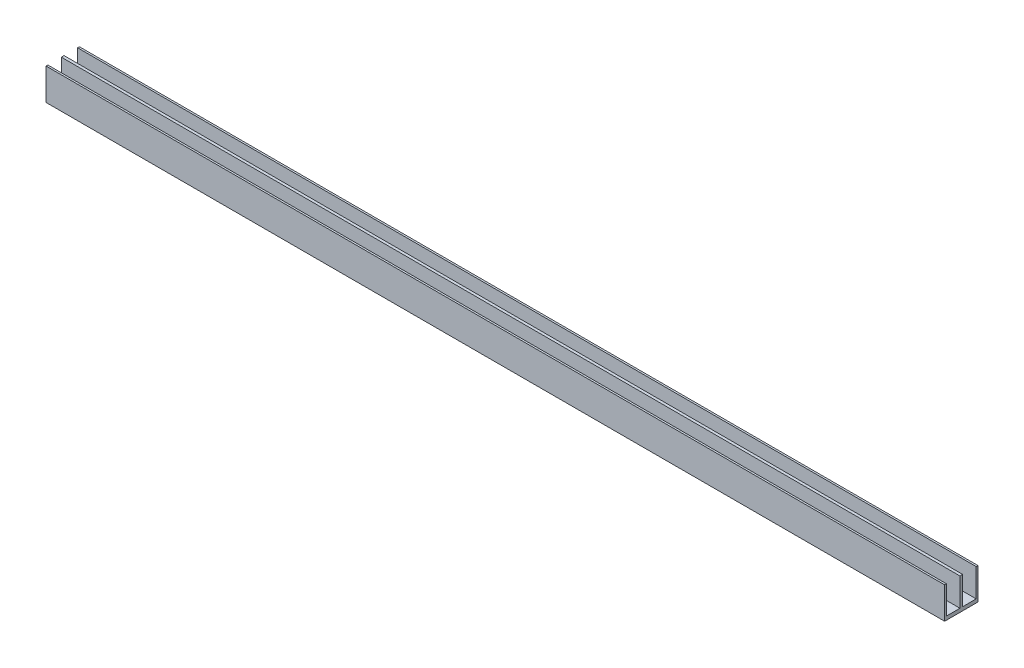
ISO-10303-21;
HEADER;
FILE_DESCRIPTION(('STEP AP214'),'2;1');
FILE_NAME('part.step','',(''),(''),'','','');
FILE_SCHEMA(('AUTOMOTIVE_DESIGN { 1 0 10303 214 1 1 1 1 }'));
ENDSEC;
DATA;
#1=APPLICATION_CONTEXT('core data for automotive mechanical design processes');
#2=APPLICATION_PROTOCOL_DEFINITION('international standard','automotive_design',2000,#1);
#3=PRODUCT_CONTEXT('',#1,'mechanical');
#4=PRODUCT('Part','Part','',(#3));
#5=PRODUCT_RELATED_PRODUCT_CATEGORY('part','',(#4));
#6=PRODUCT_DEFINITION_FORMATION('','',#4);
#7=PRODUCT_DEFINITION_CONTEXT('part definition',#1,'design');
#8=PRODUCT_DEFINITION('design','',#6,#7);
#9=PRODUCT_DEFINITION_SHAPE('','',#8);
#10=(LENGTH_UNIT() NAMED_UNIT(*) SI_UNIT(.MILLI.,.METRE.));
#11=(NAMED_UNIT(*) PLANE_ANGLE_UNIT() SI_UNIT($,.RADIAN.));
#12=(NAMED_UNIT(*) SI_UNIT($,.STERADIAN.) SOLID_ANGLE_UNIT());
#13=UNCERTAINTY_MEASURE_WITH_UNIT(LENGTH_MEASURE(1.E-05),#10,'distance_accuracy_value','');
#14=(GEOMETRIC_REPRESENTATION_CONTEXT(3) GLOBAL_UNCERTAINTY_ASSIGNED_CONTEXT((#13)) GLOBAL_UNIT_ASSIGNED_CONTEXT((#10,
#11,#12)) REPRESENTATION_CONTEXT('',''));
#15=CARTESIAN_POINT('',(0.,0.,0.));
#16=DIRECTION('',(0.,0.,1.));
#17=DIRECTION('',(1.,0.,0.));
#18=AXIS2_PLACEMENT_3D('',#15,#16,#17);
#19=CARTESIAN_POINT('',(0.,35.,0.));
#20=DIRECTION('',(0.,1.,0.));
#21=DIRECTION('',(0.,0.,1.));
#22=AXIS2_PLACEMENT_3D('',#19,#20,#21);
#23=PLANE('',#22);
#24=DIRECTION('',(0.,0.,-1.));
#25=VECTOR('',#24,1.);
#26=CARTESIAN_POINT('',(-531.123966942149,35.,-17.6446280991736));
#27=LINE('',#26,#25);
#28=CARTESIAN_POINT('',(-531.123966942149,35.,-187.644628099174));
#29=VERTEX_POINT('',#28);
#30=CARTESIAN_POINT('',(-531.123966942149,35.,-190.644628099174));
#31=VERTEX_POINT('',#30);
#32=EDGE_CURVE('E218',#29,#31,#27,.T.);
#33=ORIENTED_EDGE('',*,*,#32,.F.);
#34=DIRECTION('',(-1.,0.,0.));
#35=VECTOR('',#34,1.);
#36=CARTESIAN_POINT('',(464.876033057851,35.,-187.644628099174));
#37=LINE('',#36,#35);
#38=CARTESIAN_POINT('',(464.876033057851,35.,-187.644628099174));
#39=VERTEX_POINT('',#38);
#40=EDGE_CURVE('E182',#39,#29,#37,.T.);
#41=ORIENTED_EDGE('',*,*,#40,.F.);
#42=DIRECTION('',(0.,0.,-1.));
#43=VECTOR('',#42,1.);
#44=CARTESIAN_POINT('',(464.876033057851,35.,-207.644628099174));
#45=LINE('',#44,#43);
#46=CARTESIAN_POINT('',(464.876033057851,35.,-190.644628099174));
#47=VERTEX_POINT('',#46);
#48=EDGE_CURVE('E171',#39,#47,#45,.T.);
#49=ORIENTED_EDGE('',*,*,#48,.T.);
#50=DIRECTION('',(1.,0.,0.));
#51=VECTOR('',#50,1.);
#52=CARTESIAN_POINT('',(464.876033057851,35.,-190.644628099174));
#53=LINE('',#52,#51);
#54=EDGE_CURVE('E193',#31,#47,#53,.T.);
#55=ORIENTED_EDGE('',*,*,#54,.F.);
#56=EDGE_LOOP('',(#33,#41,#49,#55));
#57=FACE_BOUND('',#56,.T.);
#58=ADVANCED_FACE('F34',(#57),#23,.T.);
#59=CARTESIAN_POINT('',(-531.123966942149,35.,-170.644628099174));
#60=VERTEX_POINT('',#59);
#61=CARTESIAN_POINT('',(-531.123966942149,35.,-172.644628099174));
#62=VERTEX_POINT('',#61);
#63=EDGE_CURVE('E216',#60,#62,#27,.T.);
#64=ORIENTED_EDGE('',*,*,#63,.F.);
#65=DIRECTION('',(1.,0.,0.));
#66=VECTOR('',#65,1.);
#67=CARTESIAN_POINT('',(-535.123966942149,35.,-170.644628099174));
#68=LINE('',#67,#66);
#69=CARTESIAN_POINT('',(464.876033057851,35.,-170.644628099174));
#70=VERTEX_POINT('',#69);
#71=EDGE_CURVE('E145',#60,#70,#68,.T.);
#72=ORIENTED_EDGE('',*,*,#71,.T.);
#73=CARTESIAN_POINT('',(464.876033057851,35.,-172.644628099174));
#74=VERTEX_POINT('',#73);
#75=EDGE_CURVE('E162',#70,#74,#45,.T.);
#76=ORIENTED_EDGE('',*,*,#75,.T.);
#77=DIRECTION('',(1.,0.,0.));
#78=VECTOR('',#77,1.);
#79=CARTESIAN_POINT('',(464.876033057851,35.,-172.644628099174));
#80=LINE('',#79,#78);
#81=EDGE_CURVE('E179',#62,#74,#80,.T.);
#82=ORIENTED_EDGE('',*,*,#81,.F.);
#83=EDGE_LOOP('',(#64,#72,#76,#82));
#84=FACE_BOUND('',#83,.T.);
#85=ADVANCED_FACE('F226',(#84),#23,.T.);
#86=CARTESIAN_POINT('',(-535.123966942149,35.,-170.644628099174));
#87=DIRECTION('',(0.,0.,-1.));
#88=DIRECTION('',(-1.,0.,0.));
#89=AXIS2_PLACEMENT_3D('',#86,#87,#88);
#90=PLANE('',#89);
#91=ORIENTED_EDGE('',*,*,#71,.F.);
#92=DIRECTION('',(0.,-1.,0.));
#93=VECTOR('',#92,1.);
#94=CARTESIAN_POINT('',(-531.123966942149,35.,-170.644628099174));
#95=LINE('',#94,#93);
#96=CARTESIAN_POINT('',(-531.123966942149,0.,-170.644628099174));
#97=VERTEX_POINT('',#96);
#98=EDGE_CURVE('E165',#60,#97,#95,.T.);
#99=ORIENTED_EDGE('',*,*,#98,.T.);
#100=DIRECTION('',(1.,0.,0.));
#101=VECTOR('',#100,1.);
#102=CARTESIAN_POINT('',(-535.123966942149,0.,-170.644628099174));
#103=LINE('',#102,#101);
#104=CARTESIAN_POINT('',(464.876033057851,0.,-170.644628099174));
#105=VERTEX_POINT('',#104);
#106=EDGE_CURVE('E139',#97,#105,#103,.T.);
#107=ORIENTED_EDGE('',*,*,#106,.T.);
#108=DIRECTION('',(0.,-1.,0.));
#109=VECTOR('',#108,1.);
#110=CARTESIAN_POINT('',(464.876033057851,35.,-170.644628099174));
#111=LINE('',#110,#109);
#112=EDGE_CURVE('E42',#70,#105,#111,.T.);
#113=ORIENTED_EDGE('',*,*,#112,.F.);
#114=EDGE_LOOP('',(#91,#99,#107,#113));
#115=FACE_BOUND('',#114,.T.);
#116=ADVANCED_FACE('F36',(#115),#90,.F.);
#117=CARTESIAN_POINT('',(464.876033057851,35.,-207.644628099174));
#118=DIRECTION('',(-1.,0.,0.));
#119=DIRECTION('',(0.,0.,1.));
#120=AXIS2_PLACEMENT_3D('',#117,#118,#119);
#121=PLANE('',#120);
#122=DIRECTION('',(0.,0.,-1.));
#123=VECTOR('',#122,1.);
#124=CARTESIAN_POINT('',(464.876033057851,4.,-205.644628099174));
#125=LINE('',#124,#123);
#126=CARTESIAN_POINT('',(464.876033057851,4.,-190.644628099174));
#127=VERTEX_POINT('',#126);
#128=CARTESIAN_POINT('',(464.876033057851,4.,-205.644628099174));
#129=VERTEX_POINT('',#128);
#130=EDGE_CURVE('E195',#127,#129,#125,.T.);
#131=ORIENTED_EDGE('',*,*,#130,.F.);
#132=DIRECTION('',(0.,1.,0.));
#133=VECTOR('',#132,1.);
#134=CARTESIAN_POINT('',(464.876033057851,4.,-190.644628099174));
#135=LINE('',#134,#133);
#136=EDGE_CURVE('E166',#127,#47,#135,.T.);
#137=ORIENTED_EDGE('',*,*,#136,.T.);
#138=ORIENTED_EDGE('',*,*,#48,.F.);
#139=DIRECTION('',(0.,1.,0.));
#140=VECTOR('',#139,1.);
#141=CARTESIAN_POINT('',(464.876033057851,4.,-187.644628099174));
#142=LINE('',#141,#140);
#143=CARTESIAN_POINT('',(464.876033057851,4.,-187.644628099174));
#144=VERTEX_POINT('',#143);
#145=EDGE_CURVE('E173',#144,#39,#142,.T.);
#146=ORIENTED_EDGE('',*,*,#145,.F.);
#147=DIRECTION('',(0.,0.,-1.));
#148=VECTOR('',#147,1.);
#149=CARTESIAN_POINT('',(464.876033057851,4.,-187.644628099174));
#150=LINE('',#149,#148);
#151=CARTESIAN_POINT('',(464.876033057851,4.,-172.644628099174));
#152=VERTEX_POINT('',#151);
#153=EDGE_CURVE('E181',#152,#144,#150,.T.);
#154=ORIENTED_EDGE('',*,*,#153,.F.);
#155=DIRECTION('',(0.,1.,0.));
#156=VECTOR('',#155,1.);
#157=CARTESIAN_POINT('',(464.876033057851,4.,-172.644628099174));
#158=LINE('',#157,#156);
#159=EDGE_CURVE('E175',#152,#74,#158,.T.);
#160=ORIENTED_EDGE('',*,*,#159,.T.);
#161=ORIENTED_EDGE('',*,*,#75,.F.);
#162=ORIENTED_EDGE('',*,*,#112,.T.);
#163=DIRECTION('',(0.,0.,-1.));
#164=VECTOR('',#163,1.);
#165=CARTESIAN_POINT('',(464.876033057851,0.,-207.644628099174));
#166=LINE('',#165,#164);
#167=CARTESIAN_POINT('',(464.876033057851,0.,-207.644628099174));
#168=VERTEX_POINT('',#167);
#169=EDGE_CURVE('E146',#105,#168,#166,.T.);
#170=ORIENTED_EDGE('',*,*,#169,.T.);
#171=DIRECTION('',(0.,-1.,0.));
#172=VECTOR('',#171,1.);
#173=CARTESIAN_POINT('',(464.876033057851,35.,-207.644628099174));
#174=LINE('',#173,#172);
#175=CARTESIAN_POINT('',(464.876033057851,35.,-207.644628099174));
#176=VERTEX_POINT('',#175);
#177=EDGE_CURVE('E144',#176,#168,#174,.T.);
#178=ORIENTED_EDGE('',*,*,#177,.F.);
#179=CARTESIAN_POINT('',(464.876033057851,35.,-205.644628099174));
#180=VERTEX_POINT('',#179);
#181=EDGE_CURVE('E148',#180,#176,#45,.T.);
#182=ORIENTED_EDGE('',*,*,#181,.F.);
#183=DIRECTION('',(0.,1.,0.));
#184=VECTOR('',#183,1.);
#185=CARTESIAN_POINT('',(464.876033057851,4.,-205.644628099174));
#186=LINE('',#185,#184);
#187=EDGE_CURVE('E56',#129,#180,#186,.T.);
#188=ORIENTED_EDGE('',*,*,#187,.F.);
#189=EDGE_LOOP('',(#131,#137,#138,#146,#154,#160,#161,#162,#170,#178,#182,#188));
#190=FACE_BOUND('',#189,.T.);
#191=ADVANCED_FACE('F159',(#190),#121,.F.);
#192=CARTESIAN_POINT('',(-535.123966942149,35.,-207.644628099174));
#193=DIRECTION('',(0.,0.,1.));
#194=DIRECTION('',(1.,0.,0.));
#195=AXIS2_PLACEMENT_3D('',#192,#193,#194);
#196=PLANE('',#195);
#197=DIRECTION('',(-1.,0.,0.));
#198=VECTOR('',#197,1.);
#199=CARTESIAN_POINT('',(-535.123966942149,0.,-207.644628099174));
#200=LINE('',#199,#198);
#201=CARTESIAN_POINT('',(-531.123966942149,0.,-207.644628099174));
#202=VERTEX_POINT('',#201);
#203=EDGE_CURVE('E138',#168,#202,#200,.T.);
#204=ORIENTED_EDGE('',*,*,#203,.T.);
#205=DIRECTION('',(0.,-1.,0.));
#206=VECTOR('',#205,1.);
#207=CARTESIAN_POINT('',(-531.123966942149,0.,-207.644628099174));
#208=LINE('',#207,#206);
#209=CARTESIAN_POINT('',(-531.123966942149,35.,-207.644628099174));
#210=VERTEX_POINT('',#209);
#211=EDGE_CURVE('E121',#210,#202,#208,.T.);
#212=ORIENTED_EDGE('',*,*,#211,.F.);
#213=DIRECTION('',(-1.,0.,0.));
#214=VECTOR('',#213,1.);
#215=CARTESIAN_POINT('',(-535.123966942149,35.,-207.644628099174));
#216=LINE('',#215,#214);
#217=EDGE_CURVE('E153',#176,#210,#216,.T.);
#218=ORIENTED_EDGE('',*,*,#217,.F.);
#219=ORIENTED_EDGE('',*,*,#177,.T.);
#220=EDGE_LOOP('',(#204,#212,#218,#219));
#221=FACE_BOUND('',#220,.T.);
#222=ADVANCED_FACE('F142',(#221),#196,.F.);
#223=CARTESIAN_POINT('',(-531.123966942149,35.,-205.644628099174));
#224=VERTEX_POINT('',#223);
#225=EDGE_CURVE('E127',#224,#210,#27,.T.);
#226=ORIENTED_EDGE('',*,*,#225,.F.);
#227=DIRECTION('',(-1.,0.,0.));
#228=VECTOR('',#227,1.);
#229=CARTESIAN_POINT('',(464.876033057851,35.,-205.644628099174));
#230=LINE('',#229,#228);
#231=EDGE_CURVE('E178',#180,#224,#230,.T.);
#232=ORIENTED_EDGE('',*,*,#231,.F.);
#233=ORIENTED_EDGE('',*,*,#181,.T.);
#234=ORIENTED_EDGE('',*,*,#217,.T.);
#235=EDGE_LOOP('',(#226,#232,#233,#234));
#236=FACE_BOUND('',#235,.T.);
#237=ADVANCED_FACE('F229',(#236),#23,.T.);
#238=CARTESIAN_POINT('',(0.,0.,0.));
#239=DIRECTION('',(0.,1.,0.));
#240=DIRECTION('',(0.,0.,1.));
#241=AXIS2_PLACEMENT_3D('',#238,#239,#240);
#242=PLANE('',#241);
#243=ORIENTED_EDGE('',*,*,#106,.F.);
#244=DIRECTION('',(0.,0.,-1.));
#245=VECTOR('',#244,1.);
#246=CARTESIAN_POINT('',(-531.123966942149,0.,-17.6446280991736));
#247=LINE('',#246,#245);
#248=EDGE_CURVE('E124',#97,#202,#247,.T.);
#249=ORIENTED_EDGE('',*,*,#248,.T.);
#250=ORIENTED_EDGE('',*,*,#203,.F.);
#251=ORIENTED_EDGE('',*,*,#169,.F.);
#252=EDGE_LOOP('',(#243,#249,#250,#251));
#253=FACE_BOUND('',#252,.T.);
#254=ADVANCED_FACE('F136',(#253),#242,.F.);
#255=CARTESIAN_POINT('',(464.876033057851,4.,-172.644628099174));
#256=DIRECTION('',(0.,0.,1.));
#257=DIRECTION('',(1.,0.,0.));
#258=AXIS2_PLACEMENT_3D('',#255,#256,#257);
#259=PLANE('',#258);
#260=DIRECTION('',(1.,0.,0.));
#261=VECTOR('',#260,1.);
#262=CARTESIAN_POINT('',(464.876033057851,4.,-172.644628099174));
#263=LINE('',#262,#261);
#264=CARTESIAN_POINT('',(-531.123966942149,4.,-172.644628099174));
#265=VERTEX_POINT('',#264);
#266=EDGE_CURVE('E176',#265,#152,#263,.T.);
#267=ORIENTED_EDGE('',*,*,#266,.F.);
#268=DIRECTION('',(0.,1.,0.));
#269=VECTOR('',#268,1.);
#270=CARTESIAN_POINT('',(-531.123966942149,4.,-172.644628099174));
#271=LINE('',#270,#269);
#272=EDGE_CURVE('E204',#265,#62,#271,.T.);
#273=ORIENTED_EDGE('',*,*,#272,.T.);
#274=ORIENTED_EDGE('',*,*,#81,.T.);
#275=ORIENTED_EDGE('',*,*,#159,.F.);
#276=EDGE_LOOP('',(#267,#273,#274,#275));
#277=FACE_BOUND('',#276,.T.);
#278=ADVANCED_FACE('F224',(#277),#259,.F.);
#279=CARTESIAN_POINT('',(464.876033057851,4.,-187.644628099174));
#280=DIRECTION('',(0.,0.,-1.));
#281=DIRECTION('',(-1.,0.,0.));
#282=AXIS2_PLACEMENT_3D('',#279,#280,#281);
#283=PLANE('',#282);
#284=ORIENTED_EDGE('',*,*,#40,.T.);
#285=DIRECTION('',(0.,-1.,0.));
#286=VECTOR('',#285,1.);
#287=CARTESIAN_POINT('',(-531.123966942149,4.,-187.644628099174));
#288=LINE('',#287,#286);
#289=CARTESIAN_POINT('',(-531.123966942149,4.,-187.644628099174));
#290=VERTEX_POINT('',#289);
#291=EDGE_CURVE('E207',#29,#290,#288,.T.);
#292=ORIENTED_EDGE('',*,*,#291,.T.);
#293=DIRECTION('',(-1.,0.,0.));
#294=VECTOR('',#293,1.);
#295=CARTESIAN_POINT('',(464.876033057851,4.,-187.644628099174));
#296=LINE('',#295,#294);
#297=EDGE_CURVE('E186',#144,#290,#296,.T.);
#298=ORIENTED_EDGE('',*,*,#297,.F.);
#299=ORIENTED_EDGE('',*,*,#145,.T.);
#300=EDGE_LOOP('',(#284,#292,#298,#299));
#301=FACE_BOUND('',#300,.T.);
#302=ADVANCED_FACE('F267',(#301),#283,.F.);
#303=CARTESIAN_POINT('',(0.,4.,0.));
#304=DIRECTION('',(0.,-1.,0.));
#305=DIRECTION('',(0.,0.,-1.));
#306=AXIS2_PLACEMENT_3D('',#303,#304,#305);
#307=PLANE('',#306);
#308=ORIENTED_EDGE('',*,*,#297,.T.);
#309=DIRECTION('',(0.,0.,1.));
#310=VECTOR('',#309,1.);
#311=CARTESIAN_POINT('',(-531.123966942149,4.,0.));
#312=LINE('',#311,#310);
#313=EDGE_CURVE('E210',#290,#265,#312,.T.);
#314=ORIENTED_EDGE('',*,*,#313,.T.);
#315=ORIENTED_EDGE('',*,*,#266,.T.);
#316=ORIENTED_EDGE('',*,*,#153,.T.);
#317=EDGE_LOOP('',(#308,#314,#315,#316));
#318=FACE_BOUND('',#317,.T.);
#319=ADVANCED_FACE('F260',(#318),#307,.F.);
#320=CARTESIAN_POINT('',(464.876033057851,4.,-190.644628099174));
#321=DIRECTION('',(0.,0.,1.));
#322=DIRECTION('',(1.,0.,0.));
#323=AXIS2_PLACEMENT_3D('',#320,#321,#322);
#324=PLANE('',#323);
#325=DIRECTION('',(1.,0.,0.));
#326=VECTOR('',#325,1.);
#327=CARTESIAN_POINT('',(464.876033057851,4.,-190.644628099174));
#328=LINE('',#327,#326);
#329=CARTESIAN_POINT('',(-531.123966942149,4.,-190.644628099174));
#330=VERTEX_POINT('',#329);
#331=EDGE_CURVE('E191',#330,#127,#328,.T.);
#332=ORIENTED_EDGE('',*,*,#331,.F.);
#333=DIRECTION('',(0.,1.,0.));
#334=VECTOR('',#333,1.);
#335=CARTESIAN_POINT('',(-531.123966942149,4.,-190.644628099174));
#336=LINE('',#335,#334);
#337=EDGE_CURVE('E49',#330,#31,#336,.T.);
#338=ORIENTED_EDGE('',*,*,#337,.T.);
#339=ORIENTED_EDGE('',*,*,#54,.T.);
#340=ORIENTED_EDGE('',*,*,#136,.F.);
#341=EDGE_LOOP('',(#332,#338,#339,#340));
#342=FACE_BOUND('',#341,.T.);
#343=ADVANCED_FACE('F258',(#342),#324,.F.);
#344=CARTESIAN_POINT('',(464.876033057851,4.,-205.644628099174));
#345=DIRECTION('',(0.,0.,-1.));
#346=DIRECTION('',(-1.,0.,0.));
#347=AXIS2_PLACEMENT_3D('',#344,#345,#346);
#348=PLANE('',#347);
#349=ORIENTED_EDGE('',*,*,#231,.T.);
#350=DIRECTION('',(0.,-1.,0.));
#351=VECTOR('',#350,1.);
#352=CARTESIAN_POINT('',(-531.123966942149,4.,-205.644628099174));
#353=LINE('',#352,#351);
#354=CARTESIAN_POINT('',(-531.123966942149,4.,-205.644628099174));
#355=VERTEX_POINT('',#354);
#356=EDGE_CURVE('E214',#224,#355,#353,.T.);
#357=ORIENTED_EDGE('',*,*,#356,.T.);
#358=DIRECTION('',(-1.,0.,0.));
#359=VECTOR('',#358,1.);
#360=CARTESIAN_POINT('',(464.876033057851,4.,-205.644628099174));
#361=LINE('',#360,#359);
#362=EDGE_CURVE('E198',#129,#355,#361,.T.);
#363=ORIENTED_EDGE('',*,*,#362,.F.);
#364=ORIENTED_EDGE('',*,*,#187,.T.);
#365=EDGE_LOOP('',(#349,#357,#363,#364));
#366=FACE_BOUND('',#365,.T.);
#367=ADVANCED_FACE('F245',(#366),#348,.F.);
#368=CARTESIAN_POINT('',(0.,4.,0.));
#369=DIRECTION('',(0.,-1.,0.));
#370=DIRECTION('',(0.,0.,-1.));
#371=AXIS2_PLACEMENT_3D('',#368,#369,#370);
#372=PLANE('',#371);
#373=ORIENTED_EDGE('',*,*,#362,.T.);
#374=DIRECTION('',(0.,0.,1.));
#375=VECTOR('',#374,1.);
#376=CARTESIAN_POINT('',(-531.123966942149,4.,0.));
#377=LINE('',#376,#375);
#378=EDGE_CURVE('E11',#355,#330,#377,.T.);
#379=ORIENTED_EDGE('',*,*,#378,.T.);
#380=ORIENTED_EDGE('',*,*,#331,.T.);
#381=ORIENTED_EDGE('',*,*,#130,.T.);
#382=EDGE_LOOP('',(#373,#379,#380,#381));
#383=FACE_BOUND('',#382,.T.);
#384=ADVANCED_FACE('F247',(#383),#372,.F.);
#385=CARTESIAN_POINT('',(-531.123966942149,0.,-17.6446280991736));
#386=DIRECTION('',(1.,0.,0.));
#387=DIRECTION('',(0.,0.,-1.));
#388=AXIS2_PLACEMENT_3D('',#385,#386,#387);
#389=PLANE('',#388);
#390=ORIENTED_EDGE('',*,*,#63,.T.);
#391=ORIENTED_EDGE('',*,*,#272,.F.);
#392=ORIENTED_EDGE('',*,*,#313,.F.);
#393=ORIENTED_EDGE('',*,*,#291,.F.);
#394=ORIENTED_EDGE('',*,*,#32,.T.);
#395=ORIENTED_EDGE('',*,*,#337,.F.);
#396=ORIENTED_EDGE('',*,*,#378,.F.);
#397=ORIENTED_EDGE('',*,*,#356,.F.);
#398=ORIENTED_EDGE('',*,*,#225,.T.);
#399=ORIENTED_EDGE('',*,*,#211,.T.);
#400=ORIENTED_EDGE('',*,*,#248,.F.);
#401=ORIENTED_EDGE('',*,*,#98,.F.);
#402=EDGE_LOOP('',(#390,#391,#392,#393,#394,#395,#396,#397,#398,#399,#400,#401));
#403=FACE_BOUND('',#402,.T.);
#404=ADVANCED_FACE('F123',(#403),#389,.F.);
#405=CLOSED_SHELL('',(#58,#85,#116,#191,#222,#237,#254,#278,#302,#319,#343,#367,#384,#404));
#406=MANIFOLD_SOLID_BREP('B2',#405);
#407=ADVANCED_BREP_SHAPE_REPRESENTATION('',(#18,#406),#14);
#408=SHAPE_DEFINITION_REPRESENTATION(#9,#407);
ENDSEC;
END-ISO-10303-21;
